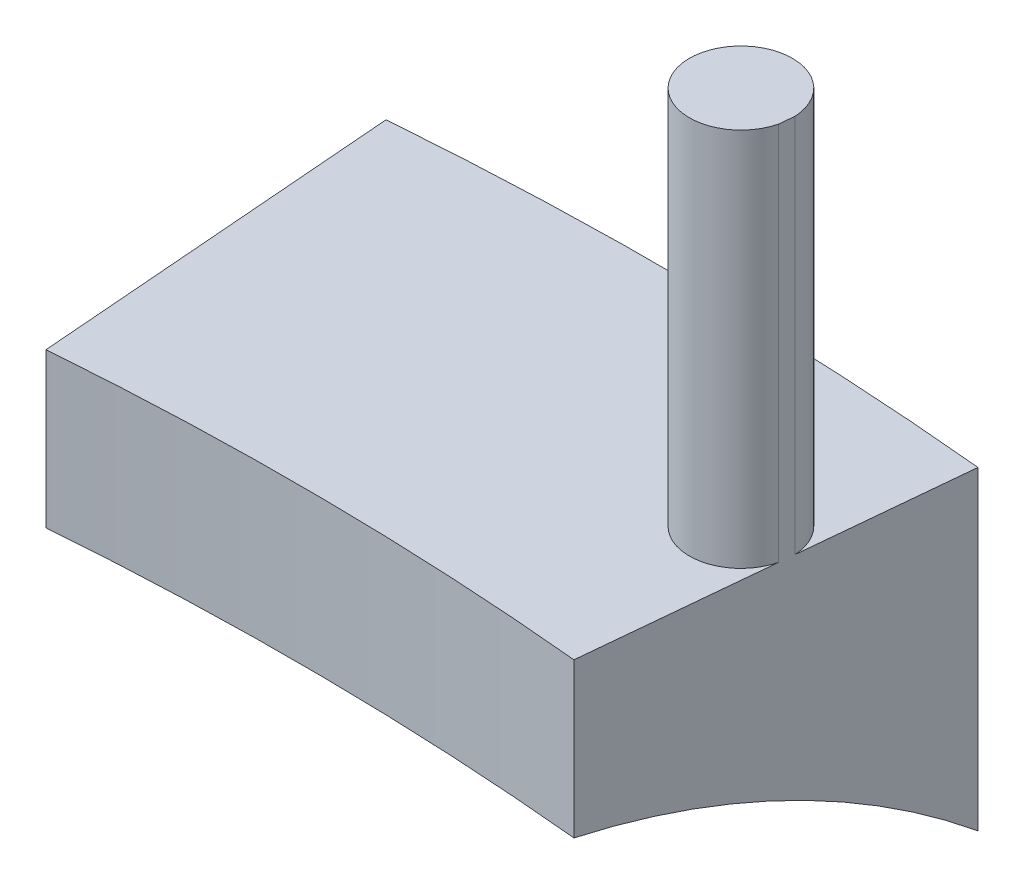
ISO-10303-21;
HEADER;
FILE_DESCRIPTION(('STEP AP214'),'2;1');
FILE_NAME('part.step','',(''),(''),'','','');
FILE_SCHEMA(('AUTOMOTIVE_DESIGN { 1 0 10303 214 1 1 1 1 }'));
ENDSEC;
DATA;
#1=APPLICATION_CONTEXT('core data for automotive mechanical design processes');
#2=APPLICATION_PROTOCOL_DEFINITION('international standard','automotive_design',2000,#1);
#3=PRODUCT_CONTEXT('',#1,'mechanical');
#4=PRODUCT('Part','Part','',(#3));
#5=PRODUCT_RELATED_PRODUCT_CATEGORY('part','',(#4));
#6=PRODUCT_DEFINITION_FORMATION('','',#4);
#7=PRODUCT_DEFINITION_CONTEXT('part definition',#1,'design');
#8=PRODUCT_DEFINITION('design','',#6,#7);
#9=PRODUCT_DEFINITION_SHAPE('','',#8);
#10=(LENGTH_UNIT() NAMED_UNIT(*) SI_UNIT(.MILLI.,.METRE.));
#11=(NAMED_UNIT(*) PLANE_ANGLE_UNIT() SI_UNIT($,.RADIAN.));
#12=(NAMED_UNIT(*) SI_UNIT($,.STERADIAN.) SOLID_ANGLE_UNIT());
#13=UNCERTAINTY_MEASURE_WITH_UNIT(LENGTH_MEASURE(1.E-05),#10,'distance_accuracy_value','');
#14=(GEOMETRIC_REPRESENTATION_CONTEXT(3) GLOBAL_UNCERTAINTY_ASSIGNED_CONTEXT((#13)) GLOBAL_UNIT_ASSIGNED_CONTEXT((#10,
#11,#12)) REPRESENTATION_CONTEXT('',''));
#15=CARTESIAN_POINT('',(0.,0.,0.));
#16=DIRECTION('',(0.,0.,1.));
#17=DIRECTION('',(1.,0.,0.));
#18=AXIS2_PLACEMENT_3D('',#15,#16,#17);
#19=CARTESIAN_POINT('',(0.,0.,0.));
#20=DIRECTION('',(0.995409707009224,0.,0.0957053561291691));
#21=DIRECTION('',(0.0957053561291691,0.,-0.995409707009224));
#22=AXIS2_PLACEMENT_3D('',#19,#20,#21);
#23=PLANE('',#22);
#24=DIRECTION('',(0.0957053561291691,0.,-0.995409707009224));
#25=VECTOR('',#24,1.);
#26=CARTESIAN_POINT('',(0.,12.954,0.));
#27=LINE('',#26,#25);
#28=CARTESIAN_POINT('',(12.8306683176364,12.954,-133.448871696935));
#29=VERTEX_POINT('',#28);
#30=CARTESIAN_POINT('',(13.491584053529,12.954,-140.32290639709));
#31=VERTEX_POINT('',#30);
#32=EDGE_CURVE('E104',#29,#31,#27,.T.);
#33=ORIENTED_EDGE('',*,*,#32,.F.);
#34=DIRECTION('',(0.,-1.,0.));
#35=VECTOR('',#34,1.);
#36=CARTESIAN_POINT('',(12.8306683176364,28.575,-133.448871696935));
#37=LINE('',#36,#35);
#38=CARTESIAN_POINT('',(12.8306683176364,28.575,-133.448871696935));
#39=VERTEX_POINT('',#38);
#40=EDGE_CURVE('E87',#39,#29,#37,.T.);
#41=ORIENTED_EDGE('',*,*,#40,.F.);
#42=DIRECTION('',(-0.0957053561291691,0.,0.995409707009224));
#43=VECTOR('',#42,1.);
#44=CARTESIAN_POINT('',(12.8013778512176,28.575,-133.144228197603));
#45=LINE('',#44,#43);
#46=CARTESIAN_POINT('',(12.7720873847989,28.575,-132.83958469827));
#47=VERTEX_POINT('',#46);
#48=EDGE_CURVE('E98',#39,#47,#45,.T.);
#49=ORIENTED_EDGE('',*,*,#48,.T.);
#50=DIRECTION('',(0.,-1.,0.));
#51=VECTOR('',#50,1.);
#52=CARTESIAN_POINT('',(12.7720873847989,28.575,-132.83958469827));
#53=LINE('',#52,#51);
#54=CARTESIAN_POINT('',(12.7720873847989,12.954,-132.83958469827));
#55=VERTEX_POINT('',#54);
#56=EDGE_CURVE('E138',#55,#47,#53,.F.);
#57=ORIENTED_EDGE('',*,*,#56,.F.);
#58=CARTESIAN_POINT('',(12.0330344261204,12.954,-125.15286246227));
#59=VERTEX_POINT('',#58);
#60=EDGE_CURVE('E107',#59,#55,#27,.T.);
#61=ORIENTED_EDGE('',*,*,#60,.F.);
#62=DIRECTION('',(0.,-1.,0.));
#63=VECTOR('',#62,1.);
#64=CARTESIAN_POINT('',(12.0330344261204,12.954,-125.15286246227));
#65=LINE('',#64,#63);
#66=CARTESIAN_POINT('',(12.0330344261204,6.604,-125.15286246227));
#67=VERTEX_POINT('',#66);
#68=EDGE_CURVE('E11',#67,#59,#65,.F.);
#69=ORIENTED_EDGE('',*,*,#68,.F.);
#70=CARTESIAN_POINT('',(11.5961832266074,-24.8161758194328,-120.609272196256));
#71=DIRECTION('',(0.995409707009224,0.,0.0957053561291691));
#72=DIRECTION('',(0.0957053561291691,0.,-0.995409707009224));
#73=AXIS2_PLACEMENT_3D('',#70,#71,#72);
#74=CIRCLE('',#73,31.75);
#75=CARTESIAN_POINT('',(13.491584053529,0.,-140.32290639709));
#76=VERTEX_POINT('',#75);
#77=EDGE_CURVE('E132',#67,#76,#74,.F.);
#78=ORIENTED_EDGE('',*,*,#77,.T.);
#79=DIRECTION('',(0.,1.,0.));
#80=VECTOR('',#79,1.);
#81=CARTESIAN_POINT('',(13.491584053529,0.,-140.32290639709));
#82=LINE('',#81,#80);
#83=EDGE_CURVE('E110',#76,#31,#82,.T.);
#84=ORIENTED_EDGE('',*,*,#83,.T.);
#85=EDGE_LOOP('',(#33,#41,#49,#57,#61,#69,#78,#84));
#86=FACE_BOUND('',#85,.T.);
#87=ADVANCED_FACE('F34',(#86),#23,.T.);
#88=CARTESIAN_POINT('',(0.,12.954,0.));
#89=DIRECTION('',(0.,-1.,0.));
#90=DIRECTION('',(0.,0.,-1.));
#91=AXIS2_PLACEMENT_3D('',#88,#89,#90);
#92=CYLINDRICAL_SURFACE('',#91,125.73);
#93=DIRECTION('',(0.,-1.,0.));
#94=VECTOR('',#93,1.);
#95=CARTESIAN_POINT('',(-9.88234090126695,12.954,-125.341023764413));
#96=LINE('',#95,#94);
#97=CARTESIAN_POINT('',(-9.88234090126695,6.604,-125.341023764413));
#98=VERTEX_POINT('',#97);
#99=CARTESIAN_POINT('',(-9.88234090126696,12.954,-125.341023764413));
#100=VERTEX_POINT('',#99);
#101=EDGE_CURVE('E42',#98,#100,#96,.F.);
#102=ORIENTED_EDGE('',*,*,#101,.F.);
#103=CARTESIAN_POINT('',(0.,6.604,0.));
#104=DIRECTION('',(0.,-1.,0.));
#105=DIRECTION('',(0.,0.,-1.));
#106=AXIS2_PLACEMENT_3D('',#103,#104,#105);
#107=CIRCLE('',#106,125.73);
#108=EDGE_CURVE('E97',#98,#67,#107,.T.);
#109=ORIENTED_EDGE('',*,*,#108,.T.);
#110=ORIENTED_EDGE('',*,*,#68,.T.);
#111=CARTESIAN_POINT('',(0.,12.954,0.));
#112=DIRECTION('',(0.,1.,0.));
#113=DIRECTION('',(0.,0.,1.));
#114=AXIS2_PLACEMENT_3D('',#111,#112,#113);
#115=CIRCLE('',#114,125.73);
#116=EDGE_CURVE('E119',#59,#100,#115,.T.);
#117=ORIENTED_EDGE('',*,*,#116,.T.);
#118=EDGE_LOOP('',(#102,#109,#110,#117));
#119=FACE_BOUND('',#118,.T.);
#120=ADVANCED_FACE('F136',(#119),#92,.F.);
#121=CARTESIAN_POINT('',(0.,0.,0.));
#122=DIRECTION('',(0.996906257571089,0.,-0.078599704933325));
#123=DIRECTION('',(-0.078599704933325,0.,-0.996906257571089));
#124=AXIS2_PLACEMENT_3D('',#121,#122,#123);
#125=PLANE('',#124);
#126=CARTESIAN_POINT('',(-9.52356917970155,-24.8161758194328,-120.790602429225));
#127=DIRECTION('',(0.996906257571089,0.,-0.078599704933325));
#128=DIRECTION('',(-0.078599704933325,0.,-0.996906257571089));
#129=AXIS2_PLACEMENT_3D('',#126,#127,#128);
#130=CIRCLE('',#129,31.75);
#131=CARTESIAN_POINT('',(-11.0802004044508,0.,-140.533875129796));
#132=VERTEX_POINT('',#131);
#133=EDGE_CURVE('E133',#98,#132,#130,.F.);
#134=ORIENTED_EDGE('',*,*,#133,.F.);
#135=ORIENTED_EDGE('',*,*,#101,.T.);
#136=DIRECTION('',(-0.078599704933325,0.,-0.996906257571089));
#137=VECTOR('',#136,1.);
#138=CARTESIAN_POINT('',(0.,12.954,0.));
#139=LINE('',#138,#137);
#140=CARTESIAN_POINT('',(-11.0802004044508,12.954,-140.533875129796));
#141=VERTEX_POINT('',#140);
#142=EDGE_CURVE('E113',#100,#141,#139,.T.);
#143=ORIENTED_EDGE('',*,*,#142,.T.);
#144=DIRECTION('',(0.,1.,0.));
#145=VECTOR('',#144,1.);
#146=CARTESIAN_POINT('',(-11.0802004044508,0.,-140.533875129796));
#147=LINE('',#146,#145);
#148=EDGE_CURVE('E117',#132,#141,#147,.T.);
#149=ORIENTED_EDGE('',*,*,#148,.F.);
#150=EDGE_LOOP('',(#134,#135,#143,#149));
#151=FACE_BOUND('',#150,.T.);
#152=ADVANCED_FACE('F135',(#151),#125,.F.);
#153=CARTESIAN_POINT('',(10.7123092398247,28.575,-133.345085245734));
#154=DIRECTION('',(0.,-1.,0.));
#155=DIRECTION('',(0.,0.,-1.));
#156=AXIS2_PLACEMENT_3D('',#153,#154,#155);
#157=CYLINDRICAL_SURFACE('',#156,2.12089999999999);
#158=CARTESIAN_POINT('',(10.7123092398247,28.575,-133.345085245734));
#159=DIRECTION('',(0.,1.,0.));
#160=DIRECTION('',(0.,0.,1.));
#161=AXIS2_PLACEMENT_3D('',#158,#159,#160);
#162=CIRCLE('',#161,2.12089999999999);
#163=EDGE_CURVE('E93',#39,#47,#162,.T.);
#164=ORIENTED_EDGE('',*,*,#163,.F.);
#165=ORIENTED_EDGE('',*,*,#40,.T.);
#166=CARTESIAN_POINT('',(10.7123092398247,12.954,-133.345085245734));
#167=DIRECTION('',(0.,1.,0.));
#168=DIRECTION('',(0.,0.,1.));
#169=AXIS2_PLACEMENT_3D('',#166,#167,#168);
#170=CIRCLE('',#169,2.12089999999999);
#171=EDGE_CURVE('E91',#55,#29,#170,.F.);
#172=ORIENTED_EDGE('',*,*,#171,.F.);
#173=ORIENTED_EDGE('',*,*,#56,.T.);
#174=EDGE_LOOP('',(#164,#165,#172,#173));
#175=FACE_BOUND('',#174,.T.);
#176=ADVANCED_FACE('F89',(#175),#157,.T.);
#177=CARTESIAN_POINT('',(0.,12.954,0.));
#178=DIRECTION('',(0.,1.,0.));
#179=DIRECTION('',(0.,0.,1.));
#180=AXIS2_PLACEMENT_3D('',#177,#178,#179);
#181=PLANE('',#180);
#182=ORIENTED_EDGE('',*,*,#60,.T.);
#183=ORIENTED_EDGE('',*,*,#171,.T.);
#184=ORIENTED_EDGE('',*,*,#32,.T.);
#185=CARTESIAN_POINT('',(0.,12.954,0.));
#186=DIRECTION('',(0.,1.,0.));
#187=DIRECTION('',(0.,0.,1.));
#188=AXIS2_PLACEMENT_3D('',#185,#186,#187);
#189=CIRCLE('',#188,140.97);
#190=EDGE_CURVE('E124',#31,#141,#189,.T.);
#191=ORIENTED_EDGE('',*,*,#190,.T.);
#192=ORIENTED_EDGE('',*,*,#142,.F.);
#193=ORIENTED_EDGE('',*,*,#116,.F.);
#194=EDGE_LOOP('',(#182,#183,#184,#191,#192,#193));
#195=FACE_BOUND('',#194,.T.);
#196=ADVANCED_FACE('F102',(#195),#181,.T.);
#197=CARTESIAN_POINT('',(0.,12.954,0.));
#198=DIRECTION('',(0.,-1.,0.));
#199=DIRECTION('',(0.,0.,-1.));
#200=AXIS2_PLACEMENT_3D('',#197,#198,#199);
#201=CYLINDRICAL_SURFACE('',#200,140.97);
#202=ORIENTED_EDGE('',*,*,#83,.F.);
#203=CARTESIAN_POINT('',(0.,0.,0.));
#204=DIRECTION('',(0.,1.,0.));
#205=DIRECTION('',(0.,0.,1.));
#206=AXIS2_PLACEMENT_3D('',#203,#204,#205);
#207=CIRCLE('',#206,140.97);
#208=EDGE_CURVE('E123',#76,#132,#207,.T.);
#209=ORIENTED_EDGE('',*,*,#208,.T.);
#210=ORIENTED_EDGE('',*,*,#148,.T.);
#211=ORIENTED_EDGE('',*,*,#190,.F.);
#212=EDGE_LOOP('',(#202,#209,#210,#211));
#213=FACE_BOUND('',#212,.T.);
#214=ADVANCED_FACE('F36',(#213),#201,.T.);
#215=CARTESIAN_POINT('',(10.7123092398247,28.575,-133.345085245734));
#216=DIRECTION('',(0.,1.,0.));
#217=DIRECTION('',(0.,0.,1.));
#218=AXIS2_PLACEMENT_3D('',#215,#216,#217);
#219=PLANE('',#218);
#220=ORIENTED_EDGE('',*,*,#48,.F.);
#221=ORIENTED_EDGE('',*,*,#163,.T.);
#222=EDGE_LOOP('',(#220,#221));
#223=FACE_BOUND('',#222,.T.);
#224=ADVANCED_FACE('F143',(#223),#219,.T.);
#225=CARTESIAN_POINT('',(0.,-24.8161758194328,0.));
#226=DIRECTION('',(0.,-1.,0.));
#227=DIRECTION('',(0.,0.,-1.));
#228=AXIS2_PLACEMENT_3D('',#225,#226,#227);
#229=TOROIDAL_SURFACE('',#228,121.165457144912,31.75);
#230=ORIENTED_EDGE('',*,*,#208,.F.);
#231=ORIENTED_EDGE('',*,*,#77,.F.);
#232=ORIENTED_EDGE('',*,*,#108,.F.);
#233=ORIENTED_EDGE('',*,*,#133,.T.);
#234=EDGE_LOOP('',(#230,#231,#232,#233));
#235=FACE_BOUND('',#234,.T.);
#236=ADVANCED_FACE('F131',(#235),#229,.F.);
#237=CLOSED_SHELL('',(#87,#120,#152,#176,#196,#214,#224,#236));
#238=MANIFOLD_SOLID_BREP('B2',#237);
#239=ADVANCED_BREP_SHAPE_REPRESENTATION('',(#18,#238),#14);
#240=SHAPE_DEFINITION_REPRESENTATION(#9,#239);
ENDSEC;
END-ISO-10303-21;
